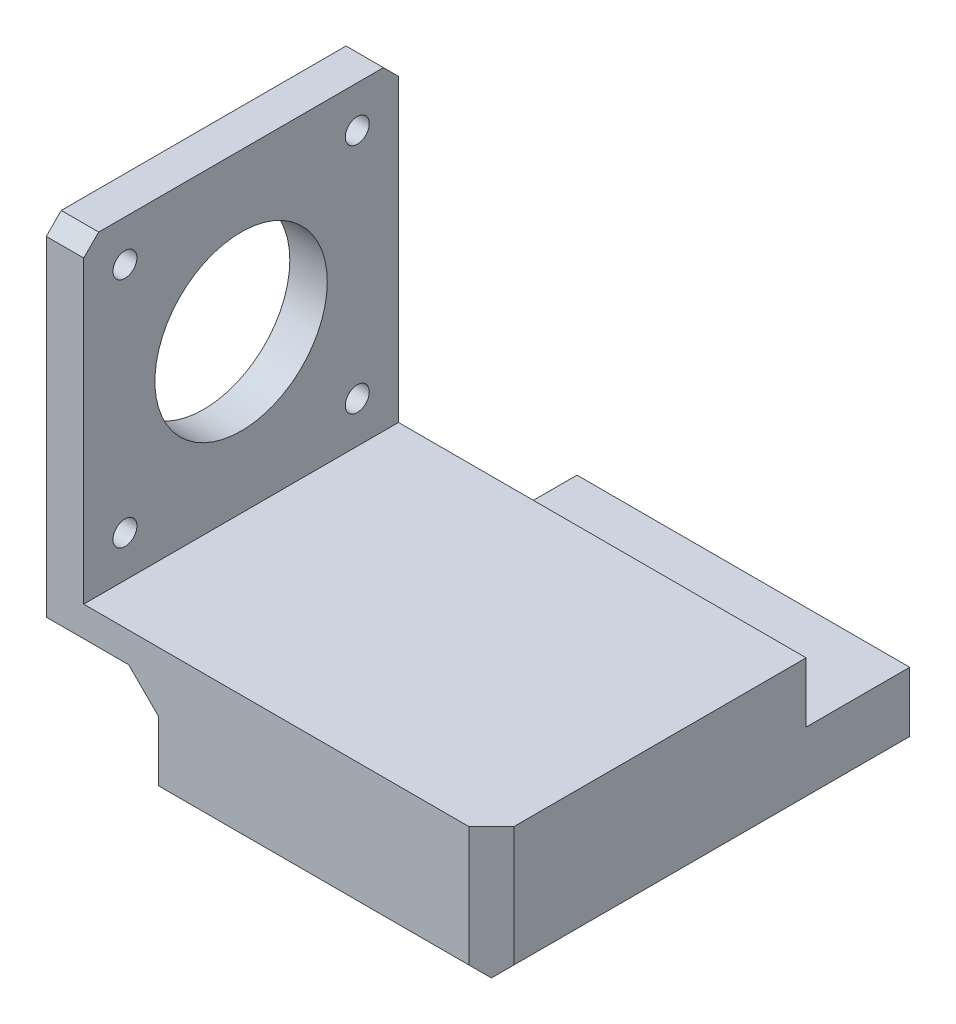
ISO-10303-21;
HEADER;
FILE_DESCRIPTION(('STEP AP214'),'2;1');
FILE_NAME('part.step','',(''),(''),'','','');
FILE_SCHEMA(('AUTOMOTIVE_DESIGN { 1 0 10303 214 1 1 1 1 }'));
ENDSEC;
DATA;
#1=APPLICATION_CONTEXT('core data for automotive mechanical design processes');
#2=APPLICATION_PROTOCOL_DEFINITION('international standard','automotive_design',2000,#1);
#3=PRODUCT_CONTEXT('',#1,'mechanical');
#4=PRODUCT('Part','Part','',(#3));
#5=PRODUCT_RELATED_PRODUCT_CATEGORY('part','',(#4));
#6=PRODUCT_DEFINITION_FORMATION('','',#4);
#7=PRODUCT_DEFINITION_CONTEXT('part definition',#1,'design');
#8=PRODUCT_DEFINITION('design','',#6,#7);
#9=PRODUCT_DEFINITION_SHAPE('','',#8);
#10=(LENGTH_UNIT() NAMED_UNIT(*) SI_UNIT(.MILLI.,.METRE.));
#11=(NAMED_UNIT(*) PLANE_ANGLE_UNIT() SI_UNIT($,.RADIAN.));
#12=(NAMED_UNIT(*) SI_UNIT($,.STERADIAN.) SOLID_ANGLE_UNIT());
#13=UNCERTAINTY_MEASURE_WITH_UNIT(LENGTH_MEASURE(1.E-05),#10,'distance_accuracy_value','');
#14=(GEOMETRIC_REPRESENTATION_CONTEXT(3) GLOBAL_UNCERTAINTY_ASSIGNED_CONTEXT((#13)) GLOBAL_UNIT_ASSIGNED_CONTEXT((#10,
#11,#12)) REPRESENTATION_CONTEXT('',''));
#15=CARTESIAN_POINT('',(0.,0.,0.));
#16=DIRECTION('',(0.,0.,1.));
#17=DIRECTION('',(1.,0.,0.));
#18=AXIS2_PLACEMENT_3D('',#15,#16,#17);
#19=CARTESIAN_POINT('',(-37.2,0.,0.));
#20=DIRECTION('',(1.,0.,0.));
#21=DIRECTION('',(0.,0.,-1.));
#22=AXIS2_PLACEMENT_3D('',#19,#20,#21);
#23=PLANE('',#22);
#24=CARTESIAN_POINT('',(-37.2,55.5,-92.32));
#25=DIRECTION('',(1.,0.,0.));
#26=DIRECTION('',(0.,0.,-1.));
#27=AXIS2_PLACEMENT_3D('',#24,#25,#26);
#28=CIRCLE('',#27,1.60000000000001);
#29=CARTESIAN_POINT('',(-37.2,55.5,-93.92));
#30=VERTEX_POINT('',#29);
#31=EDGE_CURVE('E460',#30,#30,#28,.T.);
#32=ORIENTED_EDGE('',*,*,#31,.T.);
#33=EDGE_LOOP('',(#32));
#34=FACE_BOUND('',#33,.T.);
#35=CARTESIAN_POINT('',(-37.2,24.5,-92.32));
#36=DIRECTION('',(1.,0.,0.));
#37=DIRECTION('',(0.,0.,-1.));
#38=AXIS2_PLACEMENT_3D('',#35,#36,#37);
#39=CIRCLE('',#38,1.6);
#40=CARTESIAN_POINT('',(-37.2,24.5,-93.92));
#41=VERTEX_POINT('',#40);
#42=EDGE_CURVE('E454',#41,#41,#39,.T.);
#43=ORIENTED_EDGE('',*,*,#42,.T.);
#44=EDGE_LOOP('',(#43));
#45=FACE_BOUND('',#44,.T.);
#46=CARTESIAN_POINT('',(-37.2,24.5,-61.32));
#47=DIRECTION('',(1.,0.,0.));
#48=DIRECTION('',(0.,0.,-1.));
#49=AXIS2_PLACEMENT_3D('',#46,#47,#48);
#50=CIRCLE('',#49,1.6);
#51=CARTESIAN_POINT('',(-37.2,24.5,-62.92));
#52=VERTEX_POINT('',#51);
#53=EDGE_CURVE('E445',#52,#52,#50,.T.);
#54=ORIENTED_EDGE('',*,*,#53,.T.);
#55=EDGE_LOOP('',(#54));
#56=FACE_BOUND('',#55,.T.);
#57=CARTESIAN_POINT('',(-37.2,55.5,-61.32));
#58=DIRECTION('',(1.,0.,0.));
#59=DIRECTION('',(0.,0.,-1.));
#60=AXIS2_PLACEMENT_3D('',#57,#58,#59);
#61=CIRCLE('',#60,1.6);
#62=CARTESIAN_POINT('',(-37.2,55.5,-62.92));
#63=VERTEX_POINT('',#62);
#64=EDGE_CURVE('E440',#63,#63,#61,.T.);
#65=ORIENTED_EDGE('',*,*,#64,.T.);
#66=EDGE_LOOP('',(#65));
#67=FACE_BOUND('',#66,.T.);
#68=CARTESIAN_POINT('',(-37.2,40.,-76.82));
#69=DIRECTION('',(1.,0.,0.));
#70=DIRECTION('',(0.,0.,-1.));
#71=AXIS2_PLACEMENT_3D('',#68,#69,#70);
#72=CIRCLE('',#71,11.5);
#73=CARTESIAN_POINT('',(-37.2,40.,-88.32));
#74=VERTEX_POINT('',#73);
#75=EDGE_CURVE('E292',#74,#74,#72,.T.);
#76=ORIENTED_EDGE('',*,*,#75,.T.);
#77=EDGE_LOOP('',(#76));
#78=FACE_BOUND('',#77,.T.);
#79=DIRECTION('',(0.,0.,-1.));
#80=VECTOR('',#79,1.);
#81=CARTESIAN_POINT('',(-37.2,61.,-55.82));
#82=LINE('',#81,#80);
#83=CARTESIAN_POINT('',(-37.2,61.,-57.82));
#84=VERTEX_POINT('',#83);
#85=CARTESIAN_POINT('',(-37.2,61.,-95.82));
#86=VERTEX_POINT('',#85);
#87=EDGE_CURVE('E180',#84,#86,#82,.T.);
#88=ORIENTED_EDGE('',*,*,#87,.T.);
#89=DIRECTION('',(0.,0.707106781186545,0.70710678118655));
#90=VECTOR('',#89,1.);
#91=CARTESIAN_POINT('',(-37.2,59.,-97.82));
#92=LINE('',#91,#90);
#93=CARTESIAN_POINT('',(-37.2,59.,-97.82));
#94=VERTEX_POINT('',#93);
#95=EDGE_CURVE('E54',#86,#94,#92,.F.);
#96=ORIENTED_EDGE('',*,*,#95,.T.);
#97=DIRECTION('',(0.,1.,0.));
#98=VECTOR('',#97,1.);
#99=CARTESIAN_POINT('',(-37.2,11.,-97.82));
#100=LINE('',#99,#98);
#101=CARTESIAN_POINT('',(-37.2,15.,-97.82));
#102=VERTEX_POINT('',#101);
#103=EDGE_CURVE('E178',#102,#94,#100,.T.);
#104=ORIENTED_EDGE('',*,*,#103,.F.);
#105=DIRECTION('',(0.,0.,-1.));
#106=VECTOR('',#105,1.);
#107=CARTESIAN_POINT('',(-37.2,15.,-55.82));
#108=LINE('',#107,#106);
#109=CARTESIAN_POINT('',(-37.2,15.,-55.82));
#110=VERTEX_POINT('',#109);
#111=EDGE_CURVE('E165',#110,#102,#108,.T.);
#112=ORIENTED_EDGE('',*,*,#111,.F.);
#113=DIRECTION('',(0.,1.,0.));
#114=VECTOR('',#113,1.);
#115=CARTESIAN_POINT('',(-37.2,11.,-55.82));
#116=LINE('',#115,#114);
#117=CARTESIAN_POINT('',(-37.2,59.,-55.82));
#118=VERTEX_POINT('',#117);
#119=EDGE_CURVE('E175',#110,#118,#116,.T.);
#120=ORIENTED_EDGE('',*,*,#119,.T.);
#121=DIRECTION('',(0.,0.70710678118655,-0.707106781186545));
#122=VECTOR('',#121,1.);
#123=CARTESIAN_POINT('',(-37.2,61.,-57.82));
#124=LINE('',#123,#122);
#125=EDGE_CURVE('E274',#118,#84,#124,.T.);
#126=ORIENTED_EDGE('',*,*,#125,.T.);
#127=EDGE_LOOP('',(#88,#96,#104,#112,#120,#126));
#128=FACE_BOUND('',#127,.T.);
#129=ADVANCED_FACE('F45',(#34,#45,#56,#67,#78,#128),#23,.F.);
#130=CARTESIAN_POINT('',(-32.2,0.,0.));
#131=DIRECTION('',(-1.,0.,0.));
#132=DIRECTION('',(0.,0.,1.));
#133=AXIS2_PLACEMENT_3D('',#130,#131,#132);
#134=PLANE('',#133);
#135=CARTESIAN_POINT('',(-32.2,55.5,-92.32));
#136=DIRECTION('',(1.,0.,0.));
#137=DIRECTION('',(0.,0.,-1.));
#138=AXIS2_PLACEMENT_3D('',#135,#136,#137);
#139=CIRCLE('',#138,1.60000000000001);
#140=CARTESIAN_POINT('',(-32.2,55.5,-93.92));
#141=VERTEX_POINT('',#140);
#142=EDGE_CURVE('E263',#141,#141,#139,.T.);
#143=ORIENTED_EDGE('',*,*,#142,.F.);
#144=EDGE_LOOP('',(#143));
#145=FACE_BOUND('',#144,.T.);
#146=CARTESIAN_POINT('',(-32.2,24.5,-92.32));
#147=DIRECTION('',(1.,0.,0.));
#148=DIRECTION('',(0.,0.,-1.));
#149=AXIS2_PLACEMENT_3D('',#146,#147,#148);
#150=CIRCLE('',#149,1.6);
#151=CARTESIAN_POINT('',(-32.2,24.5,-93.92));
#152=VERTEX_POINT('',#151);
#153=EDGE_CURVE('E457',#152,#152,#150,.T.);
#154=ORIENTED_EDGE('',*,*,#153,.F.);
#155=EDGE_LOOP('',(#154));
#156=FACE_BOUND('',#155,.T.);
#157=CARTESIAN_POINT('',(-32.2,24.5,-61.32));
#158=DIRECTION('',(1.,0.,0.));
#159=DIRECTION('',(0.,0.,-1.));
#160=AXIS2_PLACEMENT_3D('',#157,#158,#159);
#161=CIRCLE('',#160,1.6);
#162=CARTESIAN_POINT('',(-32.2,24.5,-62.92));
#163=VERTEX_POINT('',#162);
#164=EDGE_CURVE('E449',#163,#163,#161,.T.);
#165=ORIENTED_EDGE('',*,*,#164,.F.);
#166=EDGE_LOOP('',(#165));
#167=FACE_BOUND('',#166,.T.);
#168=CARTESIAN_POINT('',(-32.2,55.5,-61.32));
#169=DIRECTION('',(1.,0.,0.));
#170=DIRECTION('',(0.,0.,-1.));
#171=AXIS2_PLACEMENT_3D('',#168,#169,#170);
#172=CIRCLE('',#171,1.6);
#173=CARTESIAN_POINT('',(-32.2,55.5,-62.92));
#174=VERTEX_POINT('',#173);
#175=EDGE_CURVE('E443',#174,#174,#172,.T.);
#176=ORIENTED_EDGE('',*,*,#175,.F.);
#177=EDGE_LOOP('',(#176));
#178=FACE_BOUND('',#177,.T.);
#179=CARTESIAN_POINT('',(-32.2,40.,-76.82));
#180=DIRECTION('',(1.,0.,0.));
#181=DIRECTION('',(0.,0.,-1.));
#182=AXIS2_PLACEMENT_3D('',#179,#180,#181);
#183=CIRCLE('',#182,11.5);
#184=CARTESIAN_POINT('',(-32.2,40.,-88.32));
#185=VERTEX_POINT('',#184);
#186=EDGE_CURVE('E296',#185,#185,#183,.T.);
#187=ORIENTED_EDGE('',*,*,#186,.F.);
#188=EDGE_LOOP('',(#187));
#189=FACE_BOUND('',#188,.T.);
#190=DIRECTION('',(0.,-1.,0.));
#191=VECTOR('',#190,1.);
#192=CARTESIAN_POINT('',(-32.2,58.,-97.82));
#193=LINE('',#192,#191);
#194=CARTESIAN_POINT('',(-32.2,59.,-97.82));
#195=VERTEX_POINT('',#194);
#196=CARTESIAN_POINT('',(-32.2,19.,-97.82));
#197=VERTEX_POINT('',#196);
#198=EDGE_CURVE('E282',#195,#197,#193,.T.);
#199=ORIENTED_EDGE('',*,*,#198,.F.);
#200=DIRECTION('',(0.,-0.707106781186545,-0.70710678118655));
#201=VECTOR('',#200,1.);
#202=CARTESIAN_POINT('',(-32.2,59.,-97.82));
#203=LINE('',#202,#201);
#204=CARTESIAN_POINT('',(-32.2,61.,-95.82));
#205=VERTEX_POINT('',#204);
#206=EDGE_CURVE('E268',#195,#205,#203,.F.);
#207=ORIENTED_EDGE('',*,*,#206,.T.);
#208=DIRECTION('',(0.,0.,1.));
#209=VECTOR('',#208,1.);
#210=CARTESIAN_POINT('',(-32.2,61.,-55.82));
#211=LINE('',#210,#209);
#212=CARTESIAN_POINT('',(-32.2,61.,-57.82));
#213=VERTEX_POINT('',#212);
#214=EDGE_CURVE('E288',#205,#213,#211,.T.);
#215=ORIENTED_EDGE('',*,*,#214,.T.);
#216=DIRECTION('',(0.,-0.70710678118655,0.707106781186545));
#217=VECTOR('',#216,1.);
#218=CARTESIAN_POINT('',(-32.2,61.,-57.82));
#219=LINE('',#218,#217);
#220=CARTESIAN_POINT('',(-32.2,59.,-55.82));
#221=VERTEX_POINT('',#220);
#222=EDGE_CURVE('E266',#213,#221,#219,.T.);
#223=ORIENTED_EDGE('',*,*,#222,.T.);
#224=DIRECTION('',(0.,-1.,0.));
#225=VECTOR('',#224,1.);
#226=CARTESIAN_POINT('',(-32.2,15.,-55.82));
#227=LINE('',#226,#225);
#228=CARTESIAN_POINT('',(-32.2,19.,-55.82));
#229=VERTEX_POINT('',#228);
#230=EDGE_CURVE('E184',#221,#229,#227,.T.);
#231=ORIENTED_EDGE('',*,*,#230,.T.);
#232=DIRECTION('',(0.,0.,-1.));
#233=VECTOR('',#232,1.);
#234=CARTESIAN_POINT('',(-32.2,19.,-98.82));
#235=LINE('',#234,#233);
#236=EDGE_CURVE('E171',#229,#197,#235,.T.);
#237=ORIENTED_EDGE('',*,*,#236,.T.);
#238=EDGE_LOOP('',(#199,#207,#215,#223,#231,#237));
#239=FACE_BOUND('',#238,.T.);
#240=ADVANCED_FACE('F287',(#145,#156,#167,#178,#189,#239),#134,.F.);
#241=CARTESIAN_POINT('',(0.,19.,0.));
#242=DIRECTION('',(0.,-1.,0.));
#243=DIRECTION('',(0.,0.,-1.));
#244=AXIS2_PLACEMENT_3D('',#241,#242,#243);
#245=PLANE('',#244);
#246=DIRECTION('',(1.,0.,0.));
#247=VECTOR('',#246,1.);
#248=CARTESIAN_POINT('',(-22.2,19.,-55.82));
#249=LINE('',#248,#247);
#250=CARTESIAN_POINT('',(19.2,19.,-55.82));
#251=VERTEX_POINT('',#250);
#252=EDGE_CURVE('E183',#229,#251,#249,.T.);
#253=ORIENTED_EDGE('',*,*,#252,.T.);
#254=DIRECTION('',(-0.707106781186549,0.,0.707106781186546));
#255=VECTOR('',#254,1.);
#256=CARTESIAN_POINT('',(22.2,19.,-58.82));
#257=LINE('',#256,#255);
#258=CARTESIAN_POINT('',(22.2,19.,-58.82));
#259=VERTEX_POINT('',#258);
#260=EDGE_CURVE('E257',#251,#259,#257,.F.);
#261=ORIENTED_EDGE('',*,*,#260,.T.);
#262=DIRECTION('',(0.,0.,-1.));
#263=VECTOR('',#262,1.);
#264=CARTESIAN_POINT('',(22.2,19.,-55.82));
#265=LINE('',#264,#263);
#266=CARTESIAN_POINT('',(22.2,19.,-97.82));
#267=VERTEX_POINT('',#266);
#268=EDGE_CURVE('E187',#259,#267,#265,.T.);
#269=ORIENTED_EDGE('',*,*,#268,.T.);
#270=DIRECTION('',(1.,0.,0.));
#271=VECTOR('',#270,1.);
#272=CARTESIAN_POINT('',(-32.2,19.,-97.82));
#273=LINE('',#272,#271);
#274=EDGE_CURVE('E179',#197,#267,#273,.T.);
#275=ORIENTED_EDGE('',*,*,#274,.F.);
#276=ORIENTED_EDGE('',*,*,#236,.F.);
#277=EDGE_LOOP('',(#253,#261,#269,#275,#276));
#278=FACE_BOUND('',#277,.T.);
#279=ADVANCED_FACE('F320',(#278),#245,.F.);
#280=CARTESIAN_POINT('',(0.,15.,0.));
#281=DIRECTION('',(0.,-1.,0.));
#282=DIRECTION('',(0.,0.,-1.));
#283=AXIS2_PLACEMENT_3D('',#280,#281,#282);
#284=PLANE('',#283);
#285=DIRECTION('',(-1.,0.,0.));
#286=VECTOR('',#285,1.);
#287=CARTESIAN_POINT('',(-37.2,15.,-55.82));
#288=LINE('',#287,#286);
#289=CARTESIAN_POINT('',(-26.2,15.,-55.82));
#290=VERTEX_POINT('',#289);
#291=EDGE_CURVE('E161',#290,#110,#288,.T.);
#292=ORIENTED_EDGE('',*,*,#291,.T.);
#293=ORIENTED_EDGE('',*,*,#111,.T.);
#294=DIRECTION('',(-1.,0.,0.));
#295=VECTOR('',#294,1.);
#296=CARTESIAN_POINT('',(-26.2,15.,-97.82));
#297=LINE('',#296,#295);
#298=CARTESIAN_POINT('',(-26.2,15.,-97.82));
#299=VERTEX_POINT('',#298);
#300=EDGE_CURVE('E281',#299,#102,#297,.T.);
#301=ORIENTED_EDGE('',*,*,#300,.F.);
#302=DIRECTION('',(0.,0.,-1.));
#303=VECTOR('',#302,1.);
#304=CARTESIAN_POINT('',(-26.2,15.,-50.1631457505076));
#305=LINE('',#304,#303);
#306=EDGE_CURVE('E168',#290,#299,#305,.T.);
#307=ORIENTED_EDGE('',*,*,#306,.F.);
#308=EDGE_LOOP('',(#292,#293,#301,#307));
#309=FACE_BOUND('',#308,.T.);
#310=ADVANCED_FACE('F163',(#309),#284,.T.);
#311=CARTESIAN_POINT('',(-22.2,11.,-50.1631457505076));
#312=DIRECTION('',(-0.707106781186547,-0.707106781186547,0.));
#313=DIRECTION('',(0.707106781186548,-0.707106781186548,0.));
#314=AXIS2_PLACEMENT_3D('',#311,#312,#313);
#315=PLANE('',#314);
#316=ORIENTED_EDGE('',*,*,#306,.T.);
#317=DIRECTION('',(-0.707106781186548,0.707106781186548,0.));
#318=VECTOR('',#317,1.);
#319=CARTESIAN_POINT('',(-22.2,11.,-97.82));
#320=LINE('',#319,#318);
#321=CARTESIAN_POINT('',(-22.2,11.,-97.82));
#322=VERTEX_POINT('',#321);
#323=EDGE_CURVE('E308',#322,#299,#320,.T.);
#324=ORIENTED_EDGE('',*,*,#323,.F.);
#325=DIRECTION('',(0.,0.,-1.));
#326=VECTOR('',#325,1.);
#327=CARTESIAN_POINT('',(-22.2,11.,-50.1631457505076));
#328=LINE('',#327,#326);
#329=CARTESIAN_POINT('',(-22.2,11.,-55.82));
#330=VERTEX_POINT('',#329);
#331=EDGE_CURVE('E312',#330,#322,#328,.T.);
#332=ORIENTED_EDGE('',*,*,#331,.F.);
#333=DIRECTION('',(0.707106781186548,-0.707106781186548,0.));
#334=VECTOR('',#333,1.);
#335=CARTESIAN_POINT('',(-22.2,11.,-55.82));
#336=LINE('',#335,#334);
#337=EDGE_CURVE('E172',#290,#330,#336,.T.);
#338=ORIENTED_EDGE('',*,*,#337,.F.);
#339=EDGE_LOOP('',(#316,#324,#332,#338));
#340=FACE_BOUND('',#339,.T.);
#341=ADVANCED_FACE('F334',(#340),#315,.T.);
#342=CARTESIAN_POINT('',(-22.2,11.,-111.64));
#343=DIRECTION('',(1.,0.,0.));
#344=DIRECTION('',(0.,0.,1.));
#345=AXIS2_PLACEMENT_3D('',#342,#343,#344);
#346=PLANE('',#345);
#347=DIRECTION('',(0.,-1.,0.));
#348=VECTOR('',#347,1.);
#349=CARTESIAN_POINT('',(-22.2,11.,-55.82));
#350=LINE('',#349,#348);
#351=CARTESIAN_POINT('',(-22.2,3.,-55.82));
#352=VERTEX_POINT('',#351);
#353=EDGE_CURVE('E214',#330,#352,#350,.T.);
#354=ORIENTED_EDGE('',*,*,#353,.F.);
#355=ORIENTED_EDGE('',*,*,#331,.T.);
#356=DIRECTION('',(0.,0.,-1.));
#357=VECTOR('',#356,1.);
#358=CARTESIAN_POINT('',(-22.2,11.,-111.64));
#359=LINE('',#358,#357);
#360=CARTESIAN_POINT('',(-22.2,11.,-111.64));
#361=VERTEX_POINT('',#360);
#362=EDGE_CURVE('E206',#322,#361,#359,.T.);
#363=ORIENTED_EDGE('',*,*,#362,.T.);
#364=DIRECTION('',(0.,-1.,0.));
#365=VECTOR('',#364,1.);
#366=CARTESIAN_POINT('',(-22.2,11.,-111.64));
#367=LINE('',#366,#365);
#368=CARTESIAN_POINT('',(-22.2,3.,-111.64));
#369=VERTEX_POINT('',#368);
#370=EDGE_CURVE('E222',#361,#369,#367,.T.);
#371=ORIENTED_EDGE('',*,*,#370,.T.);
#372=DIRECTION('',(0.,0.,-1.));
#373=VECTOR('',#372,1.);
#374=CARTESIAN_POINT('',(-22.2,3.,-111.64));
#375=LINE('',#374,#373);
#376=EDGE_CURVE('E239',#352,#369,#375,.T.);
#377=ORIENTED_EDGE('',*,*,#376,.F.);
#378=EDGE_LOOP('',(#354,#355,#363,#371,#377));
#379=FACE_BOUND('',#378,.T.);
#380=ADVANCED_FACE('F336',(#379),#346,.F.);
#381=CARTESIAN_POINT('',(0.,11.,-111.64));
#382=DIRECTION('',(0.,-1.,0.));
#383=DIRECTION('',(0.,0.,1.));
#384=AXIS2_PLACEMENT_3D('',#381,#382,#383);
#385=PLANE('',#384);
#386=CARTESIAN_POINT('',(-10.,11.,-102.49));
#387=DIRECTION('',(0.,-1.,0.));
#388=DIRECTION('',(0.,0.,-1.));
#389=AXIS2_PLACEMENT_3D('',#386,#387,#388);
#390=CIRCLE('',#389,2.6);
#391=CARTESIAN_POINT('',(-10.,11.,-105.09));
#392=VERTEX_POINT('',#391);
#393=EDGE_CURVE('E201',#392,#392,#390,.T.);
#394=ORIENTED_EDGE('',*,*,#393,.T.);
#395=EDGE_LOOP('',(#394));
#396=FACE_BOUND('',#395,.T.);
#397=CARTESIAN_POINT('',(10.,11.,-102.49));
#398=DIRECTION('',(0.,-1.,0.));
#399=DIRECTION('',(0.,0.,-1.));
#400=AXIS2_PLACEMENT_3D('',#397,#398,#399);
#401=CIRCLE('',#400,2.6);
#402=CARTESIAN_POINT('',(10.,11.,-105.09));
#403=VERTEX_POINT('',#402);
#404=EDGE_CURVE('E198',#403,#403,#401,.T.);
#405=ORIENTED_EDGE('',*,*,#404,.T.);
#406=EDGE_LOOP('',(#405));
#407=FACE_BOUND('',#406,.T.);
#408=ORIENTED_EDGE('',*,*,#362,.F.);
#409=DIRECTION('',(-1.,0.,0.));
#410=VECTOR('',#409,1.);
#411=CARTESIAN_POINT('',(22.2,11.,-97.82));
#412=LINE('',#411,#410);
#413=CARTESIAN_POINT('',(22.2,11.,-97.82));
#414=VERTEX_POINT('',#413);
#415=EDGE_CURVE('E305',#414,#322,#412,.T.);
#416=ORIENTED_EDGE('',*,*,#415,.F.);
#417=DIRECTION('',(0.,0.,1.));
#418=VECTOR('',#417,1.);
#419=CARTESIAN_POINT('',(22.2,11.,-111.64));
#420=LINE('',#419,#418);
#421=CARTESIAN_POINT('',(22.2,11.,-111.64));
#422=VERTEX_POINT('',#421);
#423=EDGE_CURVE('E212',#422,#414,#420,.T.);
#424=ORIENTED_EDGE('',*,*,#423,.F.);
#425=DIRECTION('',(1.,0.,0.));
#426=VECTOR('',#425,1.);
#427=CARTESIAN_POINT('',(-22.2,11.,-111.64));
#428=LINE('',#427,#426);
#429=EDGE_CURVE('E209',#361,#422,#428,.T.);
#430=ORIENTED_EDGE('',*,*,#429,.F.);
#431=EDGE_LOOP('',(#408,#416,#424,#430));
#432=FACE_BOUND('',#431,.T.);
#433=ADVANCED_FACE('F330',(#396,#407,#432),#385,.F.);
#434=CARTESIAN_POINT('',(-22.2,11.,-111.64));
#435=DIRECTION('',(0.,0.,1.));
#436=DIRECTION('',(-1.,0.,0.));
#437=AXIS2_PLACEMENT_3D('',#434,#435,#436);
#438=PLANE('',#437);
#439=DIRECTION('',(1.,0.,0.));
#440=VECTOR('',#439,1.);
#441=CARTESIAN_POINT('',(-22.2,0.,-111.64));
#442=LINE('',#441,#440);
#443=CARTESIAN_POINT('',(-19.2,0.,-111.64));
#444=VERTEX_POINT('',#443);
#445=CARTESIAN_POINT('',(19.2,0.,-111.64));
#446=VERTEX_POINT('',#445);
#447=EDGE_CURVE('E197',#444,#446,#442,.T.);
#448=ORIENTED_EDGE('',*,*,#447,.F.);
#449=DIRECTION('',(0.707106781186548,-0.707106781186547,0.));
#450=VECTOR('',#449,1.);
#451=CARTESIAN_POINT('',(-22.2,3.,-111.64));
#452=LINE('',#451,#450);
#453=EDGE_CURVE('E233',#369,#444,#452,.T.);
#454=ORIENTED_EDGE('',*,*,#453,.F.);
#455=ORIENTED_EDGE('',*,*,#370,.F.);
#456=ORIENTED_EDGE('',*,*,#429,.T.);
#457=DIRECTION('',(0.,-1.,0.));
#458=VECTOR('',#457,1.);
#459=CARTESIAN_POINT('',(22.2,11.,-111.64));
#460=LINE('',#459,#458);
#461=CARTESIAN_POINT('',(22.2,3.,-111.64));
#462=VERTEX_POINT('',#461);
#463=EDGE_CURVE('E219',#422,#462,#460,.T.);
#464=ORIENTED_EDGE('',*,*,#463,.T.);
#465=DIRECTION('',(0.707106781186548,0.707106781186547,0.));
#466=VECTOR('',#465,1.);
#467=CARTESIAN_POINT('',(22.2,3.,-111.64));
#468=LINE('',#467,#466);
#469=EDGE_CURVE('E236',#446,#462,#468,.T.);
#470=ORIENTED_EDGE('',*,*,#469,.F.);
#471=EDGE_LOOP('',(#448,#454,#455,#456,#464,#470));
#472=FACE_BOUND('',#471,.T.);
#473=ADVANCED_FACE('F356',(#472),#438,.F.);
#474=CARTESIAN_POINT('',(22.2,11.,-111.64));
#475=DIRECTION('',(-1.,0.,0.));
#476=DIRECTION('',(0.,0.,-1.));
#477=AXIS2_PLACEMENT_3D('',#474,#475,#476);
#478=PLANE('',#477);
#479=ORIENTED_EDGE('',*,*,#268,.F.);
#480=DIRECTION('',(0.,-1.,0.));
#481=VECTOR('',#480,1.);
#482=CARTESIAN_POINT('',(22.2,11.,-58.82));
#483=LINE('',#482,#481);
#484=CARTESIAN_POINT('',(22.2,3.,-58.82));
#485=VERTEX_POINT('',#484);
#486=EDGE_CURVE('E255',#259,#485,#483,.T.);
#487=ORIENTED_EDGE('',*,*,#486,.T.);
#488=DIRECTION('',(0.,0.,1.));
#489=VECTOR('',#488,1.);
#490=CARTESIAN_POINT('',(22.2,3.,-55.82));
#491=LINE('',#490,#489);
#492=EDGE_CURVE('E225',#462,#485,#491,.T.);
#493=ORIENTED_EDGE('',*,*,#492,.F.);
#494=ORIENTED_EDGE('',*,*,#463,.F.);
#495=ORIENTED_EDGE('',*,*,#423,.T.);
#496=DIRECTION('',(0.,-1.,0.));
#497=VECTOR('',#496,1.);
#498=CARTESIAN_POINT('',(22.2,19.,-97.82));
#499=LINE('',#498,#497);
#500=EDGE_CURVE('E302',#267,#414,#499,.T.);
#501=ORIENTED_EDGE('',*,*,#500,.F.);
#502=EDGE_LOOP('',(#479,#487,#493,#494,#495,#501));
#503=FACE_BOUND('',#502,.T.);
#504=ADVANCED_FACE('F325',(#503),#478,.F.);
#505=CARTESIAN_POINT('',(-22.2,11.,-55.82));
#506=DIRECTION('',(0.,0.,-1.));
#507=DIRECTION('',(1.,0.,0.));
#508=AXIS2_PLACEMENT_3D('',#505,#506,#507);
#509=PLANE('',#508);
#510=ORIENTED_EDGE('',*,*,#230,.F.);
#511=DIRECTION('',(-1.,0.,0.));
#512=VECTOR('',#511,1.);
#513=CARTESIAN_POINT('',(-37.2,59.,-55.82));
#514=LINE('',#513,#512);
#515=EDGE_CURVE('E11',#221,#118,#514,.T.);
#516=ORIENTED_EDGE('',*,*,#515,.T.);
#517=ORIENTED_EDGE('',*,*,#119,.F.);
#518=ORIENTED_EDGE('',*,*,#291,.F.);
#519=ORIENTED_EDGE('',*,*,#337,.T.);
#520=ORIENTED_EDGE('',*,*,#353,.T.);
#521=DIRECTION('',(1.,0.,0.));
#522=VECTOR('',#521,1.);
#523=CARTESIAN_POINT('',(19.2,3.00000000000003,-55.82));
#524=LINE('',#523,#522);
#525=CARTESIAN_POINT('',(19.2,3.00000000000003,-55.82));
#526=VERTEX_POINT('',#525);
#527=EDGE_CURVE('E249',#352,#526,#524,.T.);
#528=ORIENTED_EDGE('',*,*,#527,.T.);
#529=DIRECTION('',(0.,1.,0.));
#530=VECTOR('',#529,1.);
#531=CARTESIAN_POINT('',(19.2,11.,-55.82));
#532=LINE('',#531,#530);
#533=EDGE_CURVE('E247',#526,#251,#532,.T.);
#534=ORIENTED_EDGE('',*,*,#533,.T.);
#535=ORIENTED_EDGE('',*,*,#252,.F.);
#536=EDGE_LOOP('',(#510,#516,#517,#518,#519,#520,#528,#534,#535));
#537=FACE_BOUND('',#536,.T.);
#538=ADVANCED_FACE('F182',(#537),#509,.F.);
#539=CARTESIAN_POINT('',(0.,0.,-111.64));
#540=DIRECTION('',(0.,-1.,0.));
#541=DIRECTION('',(0.,0.,1.));
#542=AXIS2_PLACEMENT_3D('',#539,#540,#541);
#543=PLANE('',#542);
#544=CARTESIAN_POINT('',(10.,0.,-102.49));
#545=DIRECTION('',(0.,-1.,0.));
#546=DIRECTION('',(0.,0.,-1.));
#547=AXIS2_PLACEMENT_3D('',#544,#545,#546);
#548=CIRCLE('',#547,2.6);
#549=CARTESIAN_POINT('',(10.,0.,-105.09));
#550=VERTEX_POINT('',#549);
#551=EDGE_CURVE('E194',#550,#550,#548,.T.);
#552=ORIENTED_EDGE('',*,*,#551,.F.);
#553=EDGE_LOOP('',(#552));
#554=FACE_BOUND('',#553,.T.);
#555=CARTESIAN_POINT('',(-10.,0.,-102.49));
#556=DIRECTION('',(0.,-1.,0.));
#557=DIRECTION('',(0.,0.,-1.));
#558=AXIS2_PLACEMENT_3D('',#555,#556,#557);
#559=CIRCLE('',#558,2.6);
#560=CARTESIAN_POINT('',(-10.,0.,-105.09));
#561=VERTEX_POINT('',#560);
#562=EDGE_CURVE('E193',#561,#561,#559,.T.);
#563=ORIENTED_EDGE('',*,*,#562,.F.);
#564=EDGE_LOOP('',(#563));
#565=FACE_BOUND('',#564,.T.);
#566=DIRECTION('',(0.,0.,-1.));
#567=VECTOR('',#566,1.);
#568=CARTESIAN_POINT('',(19.2,0.,-111.64));
#569=LINE('',#568,#567);
#570=CARTESIAN_POINT('',(19.2,0.,-58.82));
#571=VERTEX_POINT('',#570);
#572=EDGE_CURVE('E231',#571,#446,#569,.T.);
#573=ORIENTED_EDGE('',*,*,#572,.F.);
#574=DIRECTION('',(-1.,0.,0.));
#575=VECTOR('',#574,1.);
#576=CARTESIAN_POINT('',(-19.2,0.,-58.82));
#577=LINE('',#576,#575);
#578=CARTESIAN_POINT('',(-19.2,0.,-58.82));
#579=VERTEX_POINT('',#578);
#580=EDGE_CURVE('E242',#571,#579,#577,.T.);
#581=ORIENTED_EDGE('',*,*,#580,.T.);
#582=DIRECTION('',(0.,0.,1.));
#583=VECTOR('',#582,1.);
#584=CARTESIAN_POINT('',(-19.2,0.,-55.82));
#585=LINE('',#584,#583);
#586=EDGE_CURVE('E228',#444,#579,#585,.T.);
#587=ORIENTED_EDGE('',*,*,#586,.F.);
#588=ORIENTED_EDGE('',*,*,#447,.T.);
#589=EDGE_LOOP('',(#573,#581,#587,#588));
#590=FACE_BOUND('',#589,.T.);
#591=ADVANCED_FACE('F353',(#554,#565,#590),#543,.T.);
#592=CARTESIAN_POINT('',(22.2,3.,-111.64));
#593=DIRECTION('',(0.707106781186547,-0.707106781186548,0.));
#594=DIRECTION('',(0.,0.,-1.));
#595=AXIS2_PLACEMENT_3D('',#592,#593,#594);
#596=PLANE('',#595);
#597=DIRECTION('',(0.577350269189627,0.577350269189626,-0.577350269189624));
#598=VECTOR('',#597,1.);
#599=CARTESIAN_POINT('',(39.8066666666667,20.6066666666666,-76.4266666666666));
#600=LINE('',#599,#598);
#601=CARTESIAN_POINT('',(20.7,1.50000000000001,-57.32));
#602=VERTEX_POINT('',#601);
#603=EDGE_CURVE('E251',#485,#602,#600,.F.);
#604=ORIENTED_EDGE('',*,*,#603,.T.);
#605=DIRECTION('',(-0.577350269189628,-0.577350269189626,-0.577350269189624));
#606=VECTOR('',#605,1.);
#607=CARTESIAN_POINT('',(3.59333333333335,-15.6066666666666,-74.4266666666665));
#608=LINE('',#607,#606);
#609=EDGE_CURVE('E253',#602,#571,#608,.T.);
#610=ORIENTED_EDGE('',*,*,#609,.T.);
#611=ORIENTED_EDGE('',*,*,#572,.T.);
#612=ORIENTED_EDGE('',*,*,#469,.T.);
#613=ORIENTED_EDGE('',*,*,#492,.T.);
#614=EDGE_LOOP('',(#604,#610,#611,#612,#613));
#615=FACE_BOUND('',#614,.T.);
#616=ADVANCED_FACE('F350',(#615),#596,.T.);
#617=CARTESIAN_POINT('',(-22.2,3.,-111.64));
#618=DIRECTION('',(-0.707106781186547,-0.707106781186548,0.));
#619=DIRECTION('',(0.,0.,1.));
#620=AXIS2_PLACEMENT_3D('',#617,#618,#619);
#621=PLANE('',#620);
#622=ORIENTED_EDGE('',*,*,#586,.T.);
#623=DIRECTION('',(-0.577350269189628,0.577350269189626,0.577350269189624));
#624=VECTOR('',#623,1.);
#625=CARTESIAN_POINT('',(-3.59333333333335,-15.6066666666666,-74.4266666666665));
#626=LINE('',#625,#624);
#627=EDGE_CURVE('E245',#579,#352,#626,.T.);
#628=ORIENTED_EDGE('',*,*,#627,.T.);
#629=ORIENTED_EDGE('',*,*,#376,.T.);
#630=ORIENTED_EDGE('',*,*,#453,.T.);
#631=EDGE_LOOP('',(#622,#628,#629,#630));
#632=FACE_BOUND('',#631,.T.);
#633=ADVANCED_FACE('F359',(#632),#621,.T.);
#634=CARTESIAN_POINT('',(-10.,0.,-102.49));
#635=DIRECTION('',(0.,1.,0.));
#636=DIRECTION('',(0.,0.,-1.));
#637=AXIS2_PLACEMENT_3D('',#634,#635,#636);
#638=CYLINDRICAL_SURFACE('',#637,2.6);
#639=ORIENTED_EDGE('',*,*,#562,.T.);
#640=EDGE_LOOP('',(#639));
#641=FACE_BOUND('',#640,.T.);
#642=ORIENTED_EDGE('',*,*,#393,.F.);
#643=EDGE_LOOP('',(#642));
#644=FACE_BOUND('',#643,.T.);
#645=ADVANCED_FACE('F361',(#641,#644),#638,.F.);
#646=CARTESIAN_POINT('',(10.,0.,-102.49));
#647=DIRECTION('',(0.,1.,0.));
#648=DIRECTION('',(0.,0.,-1.));
#649=AXIS2_PLACEMENT_3D('',#646,#647,#648);
#650=CYLINDRICAL_SURFACE('',#649,2.6);
#651=ORIENTED_EDGE('',*,*,#551,.T.);
#652=EDGE_LOOP('',(#651));
#653=FACE_BOUND('',#652,.T.);
#654=ORIENTED_EDGE('',*,*,#404,.F.);
#655=EDGE_LOOP('',(#654));
#656=FACE_BOUND('',#655,.T.);
#657=ADVANCED_FACE('F368',(#653,#656),#650,.F.);
#658=CARTESIAN_POINT('',(0.,0.,-97.82));
#659=DIRECTION('',(0.,0.,-1.));
#660=DIRECTION('',(-1.,0.,0.));
#661=AXIS2_PLACEMENT_3D('',#658,#659,#660);
#662=PLANE('',#661);
#663=ORIENTED_EDGE('',*,*,#103,.T.);
#664=DIRECTION('',(1.,0.,0.));
#665=VECTOR('',#664,1.);
#666=CARTESIAN_POINT('',(0.,59.,-97.82));
#667=LINE('',#666,#665);
#668=EDGE_CURVE('E259',#94,#195,#667,.T.);
#669=ORIENTED_EDGE('',*,*,#668,.T.);
#670=ORIENTED_EDGE('',*,*,#198,.T.);
#671=ORIENTED_EDGE('',*,*,#274,.T.);
#672=ORIENTED_EDGE('',*,*,#500,.T.);
#673=ORIENTED_EDGE('',*,*,#415,.T.);
#674=ORIENTED_EDGE('',*,*,#323,.T.);
#675=ORIENTED_EDGE('',*,*,#300,.T.);
#676=EDGE_LOOP('',(#663,#669,#670,#671,#672,#673,#674,#675));
#677=FACE_BOUND('',#676,.T.);
#678=ADVANCED_FACE('F279',(#677),#662,.T.);
#679=CARTESIAN_POINT('',(-96.59696961967,61.,-55.82));
#680=DIRECTION('',(0.,1.,0.));
#681=DIRECTION('',(0.,0.,1.));
#682=AXIS2_PLACEMENT_3D('',#679,#680,#681);
#683=PLANE('',#682);
#684=ORIENTED_EDGE('',*,*,#214,.F.);
#685=DIRECTION('',(-1.,0.,0.));
#686=VECTOR('',#685,1.);
#687=CARTESIAN_POINT('',(-96.59696961967,61.,-95.82));
#688=LINE('',#687,#686);
#689=EDGE_CURVE('E67',#205,#86,#688,.T.);
#690=ORIENTED_EDGE('',*,*,#689,.T.);
#691=ORIENTED_EDGE('',*,*,#87,.F.);
#692=DIRECTION('',(1.,0.,0.));
#693=VECTOR('',#692,1.);
#694=CARTESIAN_POINT('',(-32.2,61.,-57.82));
#695=LINE('',#694,#693);
#696=EDGE_CURVE('E270',#84,#213,#695,.T.);
#697=ORIENTED_EDGE('',*,*,#696,.T.);
#698=EDGE_LOOP('',(#684,#690,#691,#697));
#699=FACE_BOUND('',#698,.T.);
#700=ADVANCED_FACE('F290',(#699),#683,.T.);
#701=CARTESIAN_POINT('',(-37.2,40.,-76.82));
#702=DIRECTION('',(1.,0.,0.));
#703=DIRECTION('',(0.,0.,-1.));
#704=AXIS2_PLACEMENT_3D('',#701,#702,#703);
#705=CYLINDRICAL_SURFACE('',#704,11.5);
#706=ORIENTED_EDGE('',*,*,#75,.F.);
#707=EDGE_LOOP('',(#706));
#708=FACE_BOUND('',#707,.T.);
#709=ORIENTED_EDGE('',*,*,#186,.T.);
#710=EDGE_LOOP('',(#709));
#711=FACE_BOUND('',#710,.T.);
#712=ADVANCED_FACE('F416',(#708,#711),#705,.F.);
#713=CARTESIAN_POINT('',(-37.2,55.5,-61.32));
#714=DIRECTION('',(1.,0.,0.));
#715=DIRECTION('',(0.,0.,-1.));
#716=AXIS2_PLACEMENT_3D('',#713,#714,#715);
#717=CYLINDRICAL_SURFACE('',#716,1.6);
#718=ORIENTED_EDGE('',*,*,#64,.F.);
#719=EDGE_LOOP('',(#718));
#720=FACE_BOUND('',#719,.T.);
#721=ORIENTED_EDGE('',*,*,#175,.T.);
#722=EDGE_LOOP('',(#721));
#723=FACE_BOUND('',#722,.T.);
#724=ADVANCED_FACE('F419',(#720,#723),#717,.F.);
#725=CARTESIAN_POINT('',(-37.2,24.5,-61.32));
#726=DIRECTION('',(1.,0.,0.));
#727=DIRECTION('',(0.,0.,-1.));
#728=AXIS2_PLACEMENT_3D('',#725,#726,#727);
#729=CYLINDRICAL_SURFACE('',#728,1.6);
#730=ORIENTED_EDGE('',*,*,#53,.F.);
#731=EDGE_LOOP('',(#730));
#732=FACE_BOUND('',#731,.T.);
#733=ORIENTED_EDGE('',*,*,#164,.T.);
#734=EDGE_LOOP('',(#733));
#735=FACE_BOUND('',#734,.T.);
#736=ADVANCED_FACE('F428',(#732,#735),#729,.F.);
#737=CARTESIAN_POINT('',(-37.2,24.5,-92.32));
#738=DIRECTION('',(1.,0.,0.));
#739=DIRECTION('',(0.,0.,-1.));
#740=AXIS2_PLACEMENT_3D('',#737,#738,#739);
#741=CYLINDRICAL_SURFACE('',#740,1.6);
#742=ORIENTED_EDGE('',*,*,#42,.F.);
#743=EDGE_LOOP('',(#742));
#744=FACE_BOUND('',#743,.T.);
#745=ORIENTED_EDGE('',*,*,#153,.T.);
#746=EDGE_LOOP('',(#745));
#747=FACE_BOUND('',#746,.T.);
#748=ADVANCED_FACE('F424',(#744,#747),#741,.F.);
#749=CARTESIAN_POINT('',(-37.2,55.5,-92.32));
#750=DIRECTION('',(1.,0.,0.));
#751=DIRECTION('',(0.,0.,-1.));
#752=AXIS2_PLACEMENT_3D('',#749,#750,#751);
#753=CYLINDRICAL_SURFACE('',#752,1.60000000000001);
#754=ORIENTED_EDGE('',*,*,#31,.F.);
#755=EDGE_LOOP('',(#754));
#756=FACE_BOUND('',#755,.T.);
#757=ORIENTED_EDGE('',*,*,#142,.T.);
#758=EDGE_LOOP('',(#757));
#759=FACE_BOUND('',#758,.T.);
#760=ADVANCED_FACE('F421',(#756,#759),#753,.F.);
#761=CARTESIAN_POINT('',(22.2,11.,-58.82));
#762=DIRECTION('',(-0.707106781186546,0.,-0.707106781186549));
#763=DIRECTION('',(0.,-1.,0.));
#764=AXIS2_PLACEMENT_3D('',#761,#762,#763);
#765=PLANE('',#764);
#766=ORIENTED_EDGE('',*,*,#260,.F.);
#767=ORIENTED_EDGE('',*,*,#533,.F.);
#768=DIRECTION('',(-0.577350269189627,0.577350269189627,0.577350269189624));
#769=VECTOR('',#768,1.);
#770=CARTESIAN_POINT('',(18.5333333333333,3.66666666666668,-55.1533333333334));
#771=LINE('',#770,#769);
#772=EDGE_CURVE('E260',#602,#526,#771,.T.);
#773=ORIENTED_EDGE('',*,*,#772,.F.);
#774=ORIENTED_EDGE('',*,*,#603,.F.);
#775=ORIENTED_EDGE('',*,*,#486,.F.);
#776=EDGE_LOOP('',(#766,#767,#773,#774,#775));
#777=FACE_BOUND('',#776,.T.);
#778=ADVANCED_FACE('F343',(#777),#765,.F.);
#779=CARTESIAN_POINT('',(0.,0.,-58.82));
#780=DIRECTION('',(0.,-0.707106781186546,0.707106781186549));
#781=DIRECTION('',(1.,0.,0.));
#782=AXIS2_PLACEMENT_3D('',#779,#780,#781);
#783=PLANE('',#782);
#784=ORIENTED_EDGE('',*,*,#772,.T.);
#785=ORIENTED_EDGE('',*,*,#527,.F.);
#786=ORIENTED_EDGE('',*,*,#627,.F.);
#787=ORIENTED_EDGE('',*,*,#580,.F.);
#788=ORIENTED_EDGE('',*,*,#609,.F.);
#789=EDGE_LOOP('',(#784,#785,#786,#787,#788));
#790=FACE_BOUND('',#789,.T.);
#791=ADVANCED_FACE('F346',(#790),#783,.T.);
#792=CARTESIAN_POINT('',(0.,59.,-97.82));
#793=DIRECTION('',(0.,-0.70710678118655,0.707106781186545));
#794=DIRECTION('',(1.,0.,0.));
#795=AXIS2_PLACEMENT_3D('',#792,#793,#794);
#796=PLANE('',#795);
#797=ORIENTED_EDGE('',*,*,#95,.F.);
#798=ORIENTED_EDGE('',*,*,#689,.F.);
#799=ORIENTED_EDGE('',*,*,#206,.F.);
#800=ORIENTED_EDGE('',*,*,#668,.F.);
#801=EDGE_LOOP('',(#797,#798,#799,#800));
#802=FACE_BOUND('',#801,.T.);
#803=ADVANCED_FACE('F284',(#802),#796,.F.);
#804=CARTESIAN_POINT('',(-96.59696961967,61.,-57.82));
#805=DIRECTION('',(0.,0.707106781186545,0.70710678118655));
#806=DIRECTION('',(-1.,0.,0.));
#807=AXIS2_PLACEMENT_3D('',#804,#805,#806);
#808=PLANE('',#807);
#809=ORIENTED_EDGE('',*,*,#125,.F.);
#810=ORIENTED_EDGE('',*,*,#515,.F.);
#811=ORIENTED_EDGE('',*,*,#222,.F.);
#812=ORIENTED_EDGE('',*,*,#696,.F.);
#813=EDGE_LOOP('',(#809,#810,#811,#812));
#814=FACE_BOUND('',#813,.T.);
#815=ADVANCED_FACE('F48',(#814),#808,.T.);
#816=CLOSED_SHELL('',(#129,#240,#279,#310,#341,#380,#433,#473,#504,#538,#591,#616,#633,#645,
#657,#678,#700,#712,#724,#736,#748,#760,#778,#791,#803,#815));
#817=MANIFOLD_SOLID_BREP('B2',#816);
#818=ADVANCED_BREP_SHAPE_REPRESENTATION('',(#18,#817),#14);
#819=SHAPE_DEFINITION_REPRESENTATION(#9,#818);
ENDSEC;
END-ISO-10303-21;
